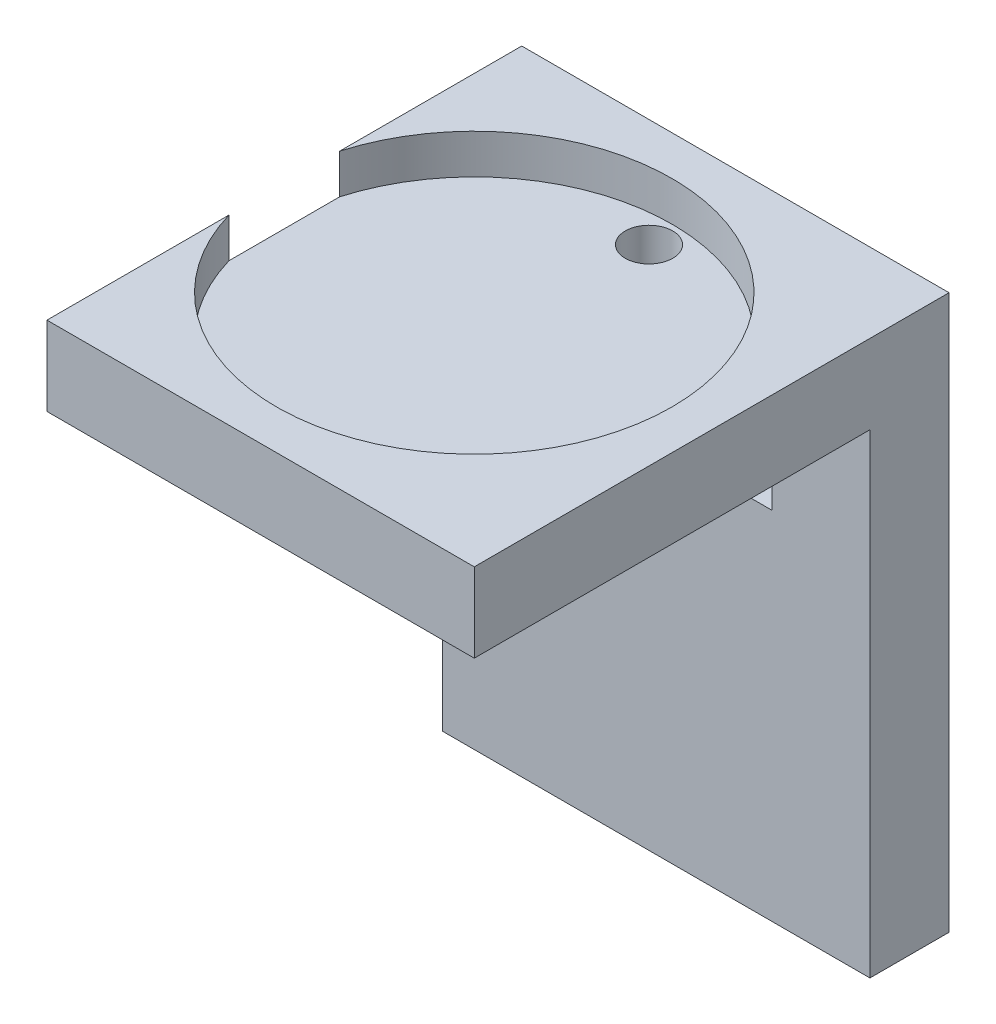
ISO-10303-21;
HEADER;
FILE_DESCRIPTION(('STEP AP214'),'2;1');
FILE_NAME('part.step','',(''),(''),'','','');
FILE_SCHEMA(('AUTOMOTIVE_DESIGN { 1 0 10303 214 1 1 1 1 }'));
ENDSEC;
DATA;
#1=APPLICATION_CONTEXT('core data for automotive mechanical design processes');
#2=APPLICATION_PROTOCOL_DEFINITION('international standard','automotive_design',2000,#1);
#3=PRODUCT_CONTEXT('',#1,'mechanical');
#4=PRODUCT('Part','Part','',(#3));
#5=PRODUCT_RELATED_PRODUCT_CATEGORY('part','',(#4));
#6=PRODUCT_DEFINITION_FORMATION('','',#4);
#7=PRODUCT_DEFINITION_CONTEXT('part definition',#1,'design');
#8=PRODUCT_DEFINITION('design','',#6,#7);
#9=PRODUCT_DEFINITION_SHAPE('','',#8);
#10=(LENGTH_UNIT() NAMED_UNIT(*) SI_UNIT(.MILLI.,.METRE.));
#11=(NAMED_UNIT(*) PLANE_ANGLE_UNIT() SI_UNIT($,.RADIAN.));
#12=(NAMED_UNIT(*) SI_UNIT($,.STERADIAN.) SOLID_ANGLE_UNIT());
#13=UNCERTAINTY_MEASURE_WITH_UNIT(LENGTH_MEASURE(1.E-05),#10,'distance_accuracy_value','');
#14=(GEOMETRIC_REPRESENTATION_CONTEXT(3) GLOBAL_UNCERTAINTY_ASSIGNED_CONTEXT((#13)) GLOBAL_UNIT_ASSIGNED_CONTEXT((#10,
#11,#12)) REPRESENTATION_CONTEXT('',''));
#15=CARTESIAN_POINT('',(0.,0.,0.));
#16=DIRECTION('',(0.,0.,1.));
#17=DIRECTION('',(1.,0.,0.));
#18=AXIS2_PLACEMENT_3D('',#15,#16,#17);
#19=CARTESIAN_POINT('',(0.,530.,0.));
#20=DIRECTION('',(0.,0.,-1.));
#21=DIRECTION('',(-1.,0.,0.));
#22=AXIS2_PLACEMENT_3D('',#19,#20,#21);
#23=PLANE('',#22);
#24=DIRECTION('',(-1.,0.,0.));
#25=VECTOR('',#24,1.);
#26=CARTESIAN_POINT('',(0.,280.,0.));
#27=LINE('',#26,#25);
#28=CARTESIAN_POINT('',(230.,280.,0.));
#29=VERTEX_POINT('',#28);
#30=CARTESIAN_POINT('',(122.,280.,0.));
#31=VERTEX_POINT('',#30);
#32=EDGE_CURVE('E182',#29,#31,#27,.T.);
#33=ORIENTED_EDGE('',*,*,#32,.T.);
#34=DIRECTION('',(0.,-1.,0.));
#35=VECTOR('',#34,1.);
#36=CARTESIAN_POINT('',(122.,530.,0.));
#37=LINE('',#36,#35);
#38=CARTESIAN_POINT('',(122.,260.,0.));
#39=VERTEX_POINT('',#38);
#40=EDGE_CURVE('E482',#31,#39,#37,.T.);
#41=ORIENTED_EDGE('',*,*,#40,.T.);
#42=DIRECTION('',(-1.,0.,0.));
#43=VECTOR('',#42,1.);
#44=CARTESIAN_POINT('',(9.99999999999982,260.,0.));
#45=LINE('',#44,#43);
#46=CARTESIAN_POINT('',(230.,260.,0.));
#47=VERTEX_POINT('',#46);
#48=EDGE_CURVE('E246',#47,#39,#45,.T.);
#49=ORIENTED_EDGE('',*,*,#48,.F.);
#50=DIRECTION('',(0.,-1.,0.));
#51=VECTOR('',#50,1.);
#52=CARTESIAN_POINT('',(230.,0.,0.));
#53=LINE('',#52,#51);
#54=EDGE_CURVE('E165',#29,#47,#53,.T.);
#55=ORIENTED_EDGE('',*,*,#54,.F.);
#56=EDGE_LOOP('',(#33,#41,#49,#55));
#57=FACE_BOUND('',#56,.T.);
#58=ADVANCED_FACE('F38',(#57),#23,.F.);
#59=CARTESIAN_POINT('',(0.,530.,-120.));
#60=DIRECTION('',(0.,0.,1.));
#61=DIRECTION('',(1.,0.,0.));
#62=AXIS2_PLACEMENT_3D('',#59,#60,#61);
#63=PLANE('',#62);
#64=DIRECTION('',(0.,1.,0.));
#65=VECTOR('',#64,1.);
#66=CARTESIAN_POINT('',(205.198613037107,530.,-120.));
#67=LINE('',#66,#65);
#68=CARTESIAN_POINT('',(205.198613037107,230.,-120.));
#69=VERTEX_POINT('',#68);
#70=CARTESIAN_POINT('',(205.198613037107,260.,-120.));
#71=VERTEX_POINT('',#70);
#72=EDGE_CURVE('E219',#69,#71,#67,.T.);
#73=ORIENTED_EDGE('',*,*,#72,.T.);
#74=DIRECTION('',(-1.,0.,0.));
#75=VECTOR('',#74,1.);
#76=CARTESIAN_POINT('',(0.,260.,-120.));
#77=LINE('',#76,#75);
#78=CARTESIAN_POINT('',(185.198613037107,260.,-120.));
#79=VERTEX_POINT('',#78);
#80=EDGE_CURVE('E223',#71,#79,#77,.T.);
#81=ORIENTED_EDGE('',*,*,#80,.T.);
#82=DIRECTION('',(0.,-1.,0.));
#83=VECTOR('',#82,1.);
#84=CARTESIAN_POINT('',(185.198613037106,530.000000000001,-120.));
#85=LINE('',#84,#83);
#86=CARTESIAN_POINT('',(185.198613037107,230.,-120.));
#87=VERTEX_POINT('',#86);
#88=EDGE_CURVE('E203',#79,#87,#85,.T.);
#89=ORIENTED_EDGE('',*,*,#88,.T.);
#90=DIRECTION('',(1.,0.,0.));
#91=VECTOR('',#90,1.);
#92=CARTESIAN_POINT('',(0.,230.,-120.));
#93=LINE('',#92,#91);
#94=EDGE_CURVE('E215',#87,#69,#93,.T.);
#95=ORIENTED_EDGE('',*,*,#94,.T.);
#96=EDGE_LOOP('',(#73,#81,#89,#95));
#97=FACE_BOUND('',#96,.T.);
#98=DIRECTION('',(0.,-1.,0.));
#99=VECTOR('',#98,1.);
#100=CARTESIAN_POINT('',(230.,0.,-120.));
#101=LINE('',#100,#99);
#102=CARTESIAN_POINT('',(230.,280.,-120.));
#103=VERTEX_POINT('',#102);
#104=CARTESIAN_POINT('',(230.,140.,-120.));
#105=VERTEX_POINT('',#104);
#106=EDGE_CURVE('E154',#103,#105,#101,.T.);
#107=ORIENTED_EDGE('',*,*,#106,.T.);
#108=DIRECTION('',(-1.,0.,0.));
#109=VECTOR('',#108,1.);
#110=CARTESIAN_POINT('',(122.,140.,-120.));
#111=LINE('',#110,#109);
#112=CARTESIAN_POINT('',(122.,140.,-120.));
#113=VERTEX_POINT('',#112);
#114=EDGE_CURVE('E139',#105,#113,#111,.T.);
#115=ORIENTED_EDGE('',*,*,#114,.T.);
#116=DIRECTION('',(0.,-1.,0.));
#117=VECTOR('',#116,1.);
#118=CARTESIAN_POINT('',(122.,0.,-120.));
#119=LINE('',#118,#117);
#120=CARTESIAN_POINT('',(122.,280.,-120.));
#121=VERTEX_POINT('',#120);
#122=EDGE_CURVE('E493',#121,#113,#119,.T.);
#123=ORIENTED_EDGE('',*,*,#122,.F.);
#124=DIRECTION('',(1.,0.,0.));
#125=VECTOR('',#124,1.);
#126=CARTESIAN_POINT('',(0.,280.,-120.));
#127=LINE('',#126,#125);
#128=EDGE_CURVE('E162',#121,#103,#127,.T.);
#129=ORIENTED_EDGE('',*,*,#128,.T.);
#130=EDGE_LOOP('',(#107,#115,#123,#129));
#131=FACE_BOUND('',#130,.T.);
#132=ADVANCED_FACE('F160',(#97,#131),#63,.F.);
#133=CARTESIAN_POINT('',(9.99999999999982,260.,-100.));
#134=DIRECTION('',(0.,1.,0.));
#135=DIRECTION('',(0.,0.,1.));
#136=AXIS2_PLACEMENT_3D('',#133,#134,#135);
#137=PLANE('',#136);
#138=ORIENTED_EDGE('',*,*,#48,.T.);
#139=DIRECTION('',(0.,0.,-1.));
#140=VECTOR('',#139,1.);
#141=CARTESIAN_POINT('',(122.,260.,-100.));
#142=LINE('',#141,#140);
#143=CARTESIAN_POINT('',(122.,260.,-100.));
#144=VERTEX_POINT('',#143);
#145=EDGE_CURVE('E316',#39,#144,#142,.T.);
#146=ORIENTED_EDGE('',*,*,#145,.T.);
#147=DIRECTION('',(-1.,0.,0.));
#148=VECTOR('',#147,1.);
#149=CARTESIAN_POINT('',(9.99999999999982,260.,-100.));
#150=LINE('',#149,#148);
#151=CARTESIAN_POINT('',(166.152945409262,260.,-100.));
#152=VERTEX_POINT('',#151);
#153=EDGE_CURVE('E252',#152,#144,#150,.T.);
#154=ORIENTED_EDGE('',*,*,#153,.F.);
#155=CARTESIAN_POINT('',(171.556693712767,260.,-102.607585908913));
#156=DIRECTION('',(0.,1.,0.));
#157=DIRECTION('',(0.,0.,1.));
#158=AXIS2_PLACEMENT_3D('',#155,#156,#157);
#159=CIRCLE('',#158,5.99999999999999);
#160=CARTESIAN_POINT('',(176.960442016273,260.,-100.));
#161=VERTEX_POINT('',#160);
#162=EDGE_CURVE('E234',#152,#161,#159,.T.);
#163=ORIENTED_EDGE('',*,*,#162,.T.);
#164=CARTESIAN_POINT('',(185.198613037107,260.,-100.));
#165=VERTEX_POINT('',#164);
#166=EDGE_CURVE('E251',#165,#161,#150,.T.);
#167=ORIENTED_EDGE('',*,*,#166,.F.);
#168=DIRECTION('',(0.,0.,1.));
#169=VECTOR('',#168,1.);
#170=CARTESIAN_POINT('',(185.198613037107,260.,-180.));
#171=LINE('',#170,#169);
#172=EDGE_CURVE('E198',#79,#165,#171,.T.);
#173=ORIENTED_EDGE('',*,*,#172,.F.);
#174=ORIENTED_EDGE('',*,*,#80,.F.);
#175=DIRECTION('',(0.,0.,1.));
#176=VECTOR('',#175,1.);
#177=CARTESIAN_POINT('',(205.198613037107,260.,-180.));
#178=LINE('',#177,#176);
#179=CARTESIAN_POINT('',(205.198613037107,260.,-100.));
#180=VERTEX_POINT('',#179);
#181=EDGE_CURVE('E199',#71,#180,#178,.T.);
#182=ORIENTED_EDGE('',*,*,#181,.T.);
#183=CARTESIAN_POINT('',(230.,260.,-100.));
#184=VERTEX_POINT('',#183);
#185=EDGE_CURVE('E247',#184,#180,#150,.T.);
#186=ORIENTED_EDGE('',*,*,#185,.F.);
#187=DIRECTION('',(0.,0.,1.));
#188=VECTOR('',#187,1.);
#189=CARTESIAN_POINT('',(230.,260.,-100.));
#190=LINE('',#189,#188);
#191=EDGE_CURVE('E176',#184,#47,#190,.T.);
#192=ORIENTED_EDGE('',*,*,#191,.T.);
#193=EDGE_LOOP('',(#138,#146,#154,#163,#167,#173,#174,#182,#186,#192));
#194=FACE_BOUND('',#193,.T.);
#195=ADVANCED_FACE('F276',(#194),#137,.F.);
#196=CARTESIAN_POINT('',(0.,0.,-100.));
#197=DIRECTION('',(0.,0.,-1.));
#198=DIRECTION('',(-1.,0.,0.));
#199=AXIS2_PLACEMENT_3D('',#196,#197,#198);
#200=PLANE('',#199);
#201=DIRECTION('',(0.,-1.,0.));
#202=VECTOR('',#201,1.);
#203=CARTESIAN_POINT('',(122.,0.,-100.));
#204=LINE('',#203,#202);
#205=CARTESIAN_POINT('',(122.,140.,-100.));
#206=VERTEX_POINT('',#205);
#207=EDGE_CURVE('E170',#144,#206,#204,.T.);
#208=ORIENTED_EDGE('',*,*,#207,.T.);
#209=DIRECTION('',(1.,0.,0.));
#210=VECTOR('',#209,1.);
#211=CARTESIAN_POINT('',(0.,140.,-100.));
#212=LINE('',#211,#210);
#213=CARTESIAN_POINT('',(230.,140.,-100.));
#214=VERTEX_POINT('',#213);
#215=EDGE_CURVE('E53',#206,#214,#212,.T.);
#216=ORIENTED_EDGE('',*,*,#215,.T.);
#217=DIRECTION('',(0.,1.,0.));
#218=VECTOR('',#217,1.);
#219=CARTESIAN_POINT('',(230.,0.,-100.));
#220=LINE('',#219,#218);
#221=EDGE_CURVE('E157',#214,#184,#220,.T.);
#222=ORIENTED_EDGE('',*,*,#221,.T.);
#223=ORIENTED_EDGE('',*,*,#185,.T.);
#224=DIRECTION('',(0.,1.,0.));
#225=VECTOR('',#224,1.);
#226=CARTESIAN_POINT('',(205.198613037107,260.,-100.));
#227=LINE('',#226,#225);
#228=CARTESIAN_POINT('',(205.198613037107,230.,-100.));
#229=VERTEX_POINT('',#228);
#230=EDGE_CURVE('E194',#229,#180,#227,.T.);
#231=ORIENTED_EDGE('',*,*,#230,.F.);
#232=DIRECTION('',(1.,0.,0.));
#233=VECTOR('',#232,1.);
#234=CARTESIAN_POINT('',(185.198613037107,230.,-100.));
#235=LINE('',#234,#233);
#236=CARTESIAN_POINT('',(185.198613037107,230.,-100.));
#237=VERTEX_POINT('',#236);
#238=EDGE_CURVE('E190',#237,#229,#235,.T.);
#239=ORIENTED_EDGE('',*,*,#238,.F.);
#240=DIRECTION('',(0.,-1.,0.));
#241=VECTOR('',#240,1.);
#242=CARTESIAN_POINT('',(185.198613037107,260.,-100.));
#243=LINE('',#242,#241);
#244=EDGE_CURVE('E186',#165,#237,#243,.T.);
#245=ORIENTED_EDGE('',*,*,#244,.F.);
#246=ORIENTED_EDGE('',*,*,#166,.T.);
#247=DIRECTION('',(0.,1.,0.));
#248=VECTOR('',#247,1.);
#249=CARTESIAN_POINT('',(176.960442016273,270.,-100.));
#250=LINE('',#249,#248);
#251=CARTESIAN_POINT('',(176.960442016273,240.,-100.));
#252=VERTEX_POINT('',#251);
#253=EDGE_CURVE('E265',#161,#252,#250,.F.);
#254=ORIENTED_EDGE('',*,*,#253,.T.);
#255=CARTESIAN_POINT('',(140.66870930764,255.020227310839,-100.));
#256=CARTESIAN_POINT('',(141.745545016972,254.375511154288,-100.));
#257=CARTESIAN_POINT('',(142.82247043188,253.730944662981,-100.));
#258=CARTESIAN_POINT('',(144.976662301267,252.442279965616,-100.));
#259=CARTESIAN_POINT('',(146.053928768085,251.798181780186,-100.));
#260=CARTESIAN_POINT('',(148.209987572857,250.510011477218,-100.));
#261=CARTESIAN_POINT('',(149.28878033758,249.865940073759,-100.));
#262=CARTESIAN_POINT('',(151.446955898395,248.578886119505,-100.));
#263=CARTESIAN_POINT('',(152.526338668762,247.93590352558,-100.));
#264=CARTESIAN_POINT('',(154.686388472894,246.65147706289,-100.));
#265=CARTESIAN_POINT('',(155.767055761645,246.010033622458,-100.));
#266=CARTESIAN_POINT('',(157.389500303464,245.050153351026,-100.));
#267=CARTESIAN_POINT('',(157.930589671992,244.730554138623,-100.));
#268=CARTESIAN_POINT('',(159.013416216859,244.092468454552,-100.));
#269=CARTESIAN_POINT('',(159.555153385662,243.773981970105,-100.));
#270=CARTESIAN_POINT('',(160.639223238488,243.138843378282,-100.));
#271=CARTESIAN_POINT('',(161.181555295487,242.822190201106,-100.));
#272=CARTESIAN_POINT('',(162.267694660169,242.191361025225,-100.));
#273=CARTESIAN_POINT('',(162.811502032711,241.87718513788,-100.));
#274=CARTESIAN_POINT('',(163.628964829865,241.40911473811,-100.));
#275=CARTESIAN_POINT('',(163.90171493313,241.253640073062,-100.));
#276=CARTESIAN_POINT('',(164.448025651478,240.944122360932,-100.));
#277=CARTESIAN_POINT('',(164.721586262407,240.790079306528,-100.));
#278=CARTESIAN_POINT('',(165.269789155945,240.483975338393,-100.));
#279=CARTESIAN_POINT('',(165.544431358033,240.331914280613,-100.));
#280=CARTESIAN_POINT('',(166.095251179756,240.030602810183,-100.));
#281=CARTESIAN_POINT('',(166.371428757506,239.881352321343,-100.));
#282=CARTESIAN_POINT('',(166.762126208396,239.67404897672,-100.));
#283=CARTESIAN_POINT('',(166.87571122211,239.614234359213,-100.));
#284=CARTESIAN_POINT('',(167.103329940756,239.495460860026,-100.));
#285=CARTESIAN_POINT('',(167.217363650562,239.436501987676,-100.));
#286=CARTESIAN_POINT('',(167.445980754043,239.319605922707,-100.));
#287=CARTESIAN_POINT('',(167.560564245109,239.261668920302,-100.));
#288=CARTESIAN_POINT('',(167.790361265167,239.147057098279,-100.));
#289=CARTESIAN_POINT('',(167.905574791467,239.090382273276,-100.));
#290=CARTESIAN_POINT('',(168.137542344556,238.978210376383,-100.));
#291=CARTESIAN_POINT('',(168.254301519405,238.922723923874,-100.));
#292=CARTESIAN_POINT('',(168.488737749721,238.813726975447,-100.));
#293=CARTESIAN_POINT('',(168.606414781917,238.76021642963,-100.));
#294=CARTESIAN_POINT('',(168.842857037724,238.655701412191,-100.));
#295=CARTESIAN_POINT('',(168.961622064727,238.604696497981,-100.));
#296=CARTESIAN_POINT('',(169.200469619515,238.505884504628,-100.));
#297=CARTESIAN_POINT('',(169.320552042238,238.458077172607,-100.));
#298=CARTESIAN_POINT('',(169.588267597971,238.356733281234,-100.));
#299=CARTESIAN_POINT('',(169.73627554076,238.304173466758,-100.));
#300=CARTESIAN_POINT('',(170.035030725225,238.207321331566,-100.));
#301=CARTESIAN_POINT('',(170.185778103406,238.163029424085,-100.));
#302=CARTESIAN_POINT('',(170.488188779936,238.086097099034,-100.));
#303=CARTESIAN_POINT('',(170.639814475566,238.053312221658,-100.));
#304=CARTESIAN_POINT('',(170.945466248453,238.001700721255,-100.));
#305=CARTESIAN_POINT('',(171.099491167642,237.982867564836,-100.));
#306=CARTESIAN_POINT('',(171.332561554369,237.966705001602,-100.));
#307=CARTESIAN_POINT('',(171.411217067294,237.963354736134,-100.));
#308=CARTESIAN_POINT('',(171.568599505715,237.96093680994,-100.));
#309=CARTESIAN_POINT('',(171.647326430792,237.961869124181,-100.));
#310=CARTESIAN_POINT('',(171.804612760325,237.96799062918,-100.));
#311=CARTESIAN_POINT('',(171.883172164762,237.973179820443,-100.));
#312=CARTESIAN_POINT('',(172.0399203249,237.98762763523,-100.));
#313=CARTESIAN_POINT('',(172.11810901431,237.996886960745,-100.));
#314=CARTESIAN_POINT('',(172.353817741922,238.030620125301,-100.));
#315=CARTESIAN_POINT('',(172.510522986131,238.060961578936,-100.));
#316=CARTESIAN_POINT('',(172.743315393228,238.115695470083,-100.));
#317=CARTESIAN_POINT('',(172.820556473922,238.13548384642,-100.));
#318=CARTESIAN_POINT('',(172.974307563305,238.177729555461,-100.));
#319=CARTESIAN_POINT('',(173.050817602283,238.200186777068,-100.));
#320=CARTESIAN_POINT('',(173.250665862279,238.262130404965,-100.));
#321=CARTESIAN_POINT('',(173.373419728525,238.303495561997,-100.));
#322=CARTESIAN_POINT('',(173.6172588527,238.390911421347,-100.));
#323=CARTESIAN_POINT('',(173.738343705826,238.436963238431,-100.));
#324=CARTESIAN_POINT('',(173.979172666962,238.53273132483,-100.));
#325=CARTESIAN_POINT('',(174.098915473261,238.582450847863,-100.));
#326=CARTESIAN_POINT('',(174.337173237009,238.684708547525,-100.));
#327=CARTESIAN_POINT('',(174.455688293528,238.737246494579,-100.));
#328=CARTESIAN_POINT('',(174.692030619059,238.844686876755,-100.));
#329=CARTESIAN_POINT('',(174.809855108878,238.899595403734,-100.));
#330=CARTESIAN_POINT('',(175.044661762844,239.011188053382,-100.));
#331=CARTESIAN_POINT('',(175.161643902324,239.06787222779,-100.));
#332=CARTESIAN_POINT('',(175.5114263292,239.239986042704,-100.));
#333=CARTESIAN_POINT('',(175.743183798586,239.357532994722,-100.));
#334=CARTESIAN_POINT('',(176.206674113443,239.597368577542,-100.));
#335=CARTESIAN_POINT('',(176.438390580959,239.719688615419,-100.));
#336=CARTESIAN_POINT('',(176.900423461,239.966999327591,-100.));
#337=CARTESIAN_POINT('',(177.130739718648,240.091990290652,-100.));
#338=CARTESIAN_POINT('',(177.589882417134,240.343640495827,-100.));
#339=CARTESIAN_POINT('',(177.818710867789,240.470296079725,-100.));
#340=CARTESIAN_POINT('',(178.275568382777,240.725018610191,-100.));
#341=CARTESIAN_POINT('',(178.503597477372,240.85308550255,-100.));
#342=CARTESIAN_POINT('',(179.180935094493,241.235579017768,-100.));
#343=CARTESIAN_POINT('',(179.629372766938,241.491546662386,-100.));
#344=CARTESIAN_POINT('',(180.524786827119,242.006027467012,-100.));
#345=CARTESIAN_POINT('',(180.971763200384,242.264540652127,-100.));
#346=CARTESIAN_POINT('',(181.864747552623,242.783271882302,-100.));
#347=CARTESIAN_POINT('',(182.310755494456,243.043489991261,-100.));
#348=CARTESIAN_POINT('',(183.202081163217,243.565106104294,-100.));
#349=CARTESIAN_POINT('',(183.647398889107,243.826504110136,-100.));
#350=CARTESIAN_POINT('',(184.983434411144,244.612437757886,-100.));
#351=CARTESIAN_POINT('',(185.873411101031,245.138232793207,-100.));
#352=CARTESIAN_POINT('',(187.652229968038,246.191696812352,-100.));
#353=CARTESIAN_POINT('',(188.541072166644,246.71936575995,-100.));
#354=CARTESIAN_POINT('',(190.272563735469,247.748852611933,-100.));
#355=CARTESIAN_POINT('',(191.115248468207,248.250611048623,-100.));
#356=CARTESIAN_POINT('',(192.800189868967,249.254857987687,-100.));
#357=CARTESIAN_POINT('',(193.642446534254,249.757346494648,-100.));
#358=CARTESIAN_POINT('',(195.325819468977,250.762339234044,-100.));
#359=CARTESIAN_POINT('',(196.166936041845,251.264842958297,-100.));
#360=CARTESIAN_POINT('',(197.848933320306,252.270232124848,-100.));
#361=CARTESIAN_POINT('',(198.689814027453,252.773117564544,-100.));
#362=CARTESIAN_POINT('',(199.53061755367,253.276131874134,-100.));
#363=B_SPLINE_CURVE_WITH_KNOTS('',3,(#255,#256,#257,#258,#259,#260,#261,#262,#263,#264,#265,
#266,#267,#268,#269,#270,#271,#272,#273,#274,#275,#276,#277,#278,#279,#280,#281,#282,#283,#284,
#285,#286,#287,#288,#289,#290,#291,#292,#293,#294,#295,#296,#297,#298,#299,#300,#301,#302,#303,
#304,#305,#306,#307,#308,#309,#310,#311,#312,#313,#314,#315,#316,#317,#318,#319,#320,#321,#322,
#323,#324,#325,#326,#327,#328,#329,#330,#331,#332,#333,#334,#335,#336,#337,#338,#339,#340,#341,
#342,#343,#344,#345,#346,#347,#348,#349,#350,#351,#352,#353,#354,#355,#356,#357,#358,#359,#360,
#361,#362),.UNSPECIFIED.,.F.,.F.,(4,2,2,2,2,2,2,2,2,2,2,2,2,2,2,2,2,2,2,2,2,2,2,2,2,2,2,2,2,2,2,
2,2,2,2,2,2,2,2,2,2,2,2,2,2,2,2,2,2,2,2,2,2,4),(0.,3.76524998170982,7.53065681727313,
11.2999528721338,15.0690959484566,18.8391883257358,20.724470583309,22.6097311181685,
24.4937502552806,26.3778536052763,27.3197025469165,28.261546668986,29.2033219522121,
30.1450716684229,30.5301845448842,30.9153016165462,31.3004896341273,31.6856760081172,
32.0734796754741,32.4612735427971,32.8489986631907,33.2366930844613,33.707706101691,
34.1787426541159,34.6436343837702,35.1083082733584,35.3443871450296,35.5804646367498,
35.81654215651,36.0526604095171,36.5307486293776,36.769925950269,37.0090933183722,
37.3975697492823,37.7861387999268,38.1750568047807,38.5639431781515,38.9538965223592,
39.3438612395432,40.1233903096002,40.909431175455,41.6955574578999,42.4801764441517,
43.2647653966137,44.8137947948122,46.3628394871519,47.91194257289,49.4610479830774,
52.5621185511612,55.663129492585,58.6053919358587,61.5476729496611,64.4870407471998,
67.426388680556),.UNSPECIFIED.);
#364=CARTESIAN_POINT('',(166.152945409262,240.,-100.));
#365=VERTEX_POINT('',#364);
#366=EDGE_CURVE('E250',#252,#365,#363,.F.);
#367=ORIENTED_EDGE('',*,*,#366,.T.);
#368=DIRECTION('',(0.,1.,0.));
#369=VECTOR('',#368,1.);
#370=CARTESIAN_POINT('',(166.152945409262,270.,-100.));
#371=LINE('',#370,#369);
#372=EDGE_CURVE('E46',#365,#152,#371,.T.);
#373=ORIENTED_EDGE('',*,*,#372,.T.);
#374=ORIENTED_EDGE('',*,*,#153,.T.);
#375=EDGE_LOOP('',(#208,#216,#222,#223,#231,#239,#245,#246,#254,#367,#373,#374));
#376=FACE_BOUND('',#375,.T.);
#377=ADVANCED_FACE('F270',(#376),#200,.F.);
#378=CARTESIAN_POINT('',(340.,280.,-100.));
#379=DIRECTION('',(0.,-1.,0.));
#380=DIRECTION('',(0.,0.,-1.));
#381=AXIS2_PLACEMENT_3D('',#378,#379,#380);
#382=PLANE('',#381);
#383=ORIENTED_EDGE('',*,*,#128,.F.);
#384=DIRECTION('',(0.,0.,1.));
#385=VECTOR('',#384,1.);
#386=CARTESIAN_POINT('',(122.,280.,-100.));
#387=LINE('',#386,#385);
#388=CARTESIAN_POINT('',(122.,280.,-73.9999999999998));
#389=VERTEX_POINT('',#388);
#390=EDGE_CURVE('E480',#121,#389,#387,.T.);
#391=ORIENTED_EDGE('',*,*,#390,.T.);
#392=CARTESIAN_POINT('',(170.,280.,-60.));
#393=DIRECTION('',(0.,-1.,0.));
#394=DIRECTION('',(0.,0.,-1.));
#395=AXIS2_PLACEMENT_3D('',#392,#393,#394);
#396=CIRCLE('',#395,50.);
#397=CARTESIAN_POINT('',(122.,280.,-46.0000000000001));
#398=VERTEX_POINT('',#397);
#399=EDGE_CURVE('E242',#389,#398,#396,.T.);
#400=ORIENTED_EDGE('',*,*,#399,.T.);
#401=EDGE_CURVE('E479',#398,#31,#387,.T.);
#402=ORIENTED_EDGE('',*,*,#401,.T.);
#403=ORIENTED_EDGE('',*,*,#32,.F.);
#404=DIRECTION('',(0.,0.,1.));
#405=VECTOR('',#404,1.);
#406=CARTESIAN_POINT('',(230.,280.,-120.));
#407=LINE('',#406,#405);
#408=EDGE_CURVE('E164',#103,#29,#407,.T.);
#409=ORIENTED_EDGE('',*,*,#408,.F.);
#410=EDGE_LOOP('',(#383,#391,#400,#402,#403,#409));
#411=FACE_BOUND('',#410,.T.);
#412=ADVANCED_FACE('F275',(#411),#382,.F.);
#413=CARTESIAN_POINT('',(170.,270.,-60.));
#414=DIRECTION('',(0.,1.,0.));
#415=DIRECTION('',(0.,0.,1.));
#416=AXIS2_PLACEMENT_3D('',#413,#414,#415);
#417=CYLINDRICAL_SURFACE('',#416,50.);
#418=ORIENTED_EDGE('',*,*,#399,.F.);
#419=DIRECTION('',(0.,1.,0.));
#420=VECTOR('',#419,1.);
#421=CARTESIAN_POINT('',(122.,270.,-73.9999999999998));
#422=LINE('',#421,#420);
#423=CARTESIAN_POINT('',(122.,270.,-73.9999999999998));
#424=VERTEX_POINT('',#423);
#425=EDGE_CURVE('E475',#389,#424,#422,.F.);
#426=ORIENTED_EDGE('',*,*,#425,.T.);
#427=CARTESIAN_POINT('',(170.,270.,-60.));
#428=DIRECTION('',(0.,1.,0.));
#429=DIRECTION('',(0.,0.,1.));
#430=AXIS2_PLACEMENT_3D('',#427,#428,#429);
#431=CIRCLE('',#430,50.);
#432=CARTESIAN_POINT('',(122.,270.,-46.0000000000001));
#433=VERTEX_POINT('',#432);
#434=EDGE_CURVE('E238',#433,#424,#431,.T.);
#435=ORIENTED_EDGE('',*,*,#434,.F.);
#436=DIRECTION('',(0.,1.,0.));
#437=VECTOR('',#436,1.);
#438=CARTESIAN_POINT('',(122.,270.,-46.0000000000001));
#439=LINE('',#438,#437);
#440=EDGE_CURVE('E60',#433,#398,#439,.T.);
#441=ORIENTED_EDGE('',*,*,#440,.T.);
#442=EDGE_LOOP('',(#418,#426,#435,#441));
#443=FACE_BOUND('',#442,.T.);
#444=ADVANCED_FACE('F332',(#443),#417,.F.);
#445=CARTESIAN_POINT('',(170.,270.,-60.));
#446=DIRECTION('',(0.,1.,0.));
#447=DIRECTION('',(0.,0.,1.));
#448=AXIS2_PLACEMENT_3D('',#445,#446,#447);
#449=PLANE('',#448);
#450=DIRECTION('',(0.,0.,-1.));
#451=VECTOR('',#450,1.);
#452=CARTESIAN_POINT('',(122.,270.,-60.));
#453=LINE('',#452,#451);
#454=EDGE_CURVE('E11',#433,#424,#453,.T.);
#455=ORIENTED_EDGE('',*,*,#454,.F.);
#456=ORIENTED_EDGE('',*,*,#434,.T.);
#457=EDGE_LOOP('',(#455,#456));
#458=FACE_BOUND('',#457,.T.);
#459=CARTESIAN_POINT('',(171.556693712767,270.,-102.607585908913));
#460=DIRECTION('',(0.,1.,0.));
#461=DIRECTION('',(0.,0.,1.));
#462=AXIS2_PLACEMENT_3D('',#459,#460,#461);
#463=CIRCLE('',#462,5.99999999999998);
#464=CARTESIAN_POINT('',(171.556693712767,270.,-96.6075859089127));
#465=VERTEX_POINT('',#464);
#466=EDGE_CURVE('E227',#465,#465,#463,.T.);
#467=ORIENTED_EDGE('',*,*,#466,.F.);
#468=EDGE_LOOP('',(#467));
#469=FACE_BOUND('',#468,.T.);
#470=ADVANCED_FACE('F327',(#458,#469),#449,.T.);
#471=CARTESIAN_POINT('',(171.556693712767,270.,-102.607585908913));
#472=DIRECTION('',(0.,1.,0.));
#473=DIRECTION('',(0.,0.,1.));
#474=AXIS2_PLACEMENT_3D('',#471,#472,#473);
#475=CYLINDRICAL_SURFACE('',#474,5.99999999999999);
#476=ORIENTED_EDGE('',*,*,#466,.T.);
#477=EDGE_LOOP('',(#476));
#478=FACE_BOUND('',#477,.T.);
#479=CARTESIAN_POINT('',(171.556693712767,240.,-102.607585908913));
#480=DIRECTION('',(0.,1.,0.));
#481=DIRECTION('',(0.,0.,1.));
#482=AXIS2_PLACEMENT_3D('',#479,#480,#481);
#483=CIRCLE('',#482,6.00000000000001);
#484=EDGE_CURVE('E231',#252,#365,#483,.T.);
#485=ORIENTED_EDGE('',*,*,#484,.F.);
#486=ORIENTED_EDGE('',*,*,#253,.F.);
#487=ORIENTED_EDGE('',*,*,#162,.F.);
#488=ORIENTED_EDGE('',*,*,#372,.F.);
#489=EDGE_LOOP('',(#485,#486,#487,#488));
#490=FACE_BOUND('',#489,.T.);
#491=ADVANCED_FACE('F309',(#478,#490),#475,.F.);
#492=CARTESIAN_POINT('',(171.556693712767,240.,-102.607585908913));
#493=DIRECTION('',(0.,1.,0.));
#494=DIRECTION('',(0.,0.,1.));
#495=AXIS2_PLACEMENT_3D('',#492,#493,#494);
#496=CONICAL_SURFACE('',#495,6.00000000000001,1.02974425867666);
#497=CARTESIAN_POINT('',(171.556693712767,236.394836285835,-102.607585908913));
#498=VERTEX_POINT('',#497);
#499=VERTEX_LOOP('',#498);
#500=FACE_BOUND('',#499,.T.);
#501=ORIENTED_EDGE('',*,*,#484,.T.);
#502=ORIENTED_EDGE('',*,*,#366,.F.);
#503=EDGE_LOOP('',(#501,#502));
#504=FACE_BOUND('',#503,.T.);
#505=ADVANCED_FACE('F266',(#500,#504),#496,.F.);
#506=CARTESIAN_POINT('',(205.198613037107,260.,-180.));
#507=DIRECTION('',(1.,0.,0.));
#508=DIRECTION('',(0.,0.,-1.));
#509=AXIS2_PLACEMENT_3D('',#506,#507,#508);
#510=PLANE('',#509);
#511=DIRECTION('',(0.,0.,1.));
#512=VECTOR('',#511,1.);
#513=CARTESIAN_POINT('',(205.198613037107,230.,-180.));
#514=LINE('',#513,#512);
#515=EDGE_CURVE('E204',#69,#229,#514,.T.);
#516=ORIENTED_EDGE('',*,*,#515,.T.);
#517=ORIENTED_EDGE('',*,*,#230,.T.);
#518=ORIENTED_EDGE('',*,*,#181,.F.);
#519=ORIENTED_EDGE('',*,*,#72,.F.);
#520=EDGE_LOOP('',(#516,#517,#518,#519));
#521=FACE_BOUND('',#520,.T.);
#522=ADVANCED_FACE('F292',(#521),#510,.F.);
#523=CARTESIAN_POINT('',(185.198613037107,230.,-180.));
#524=DIRECTION('',(0.,-1.,0.));
#525=DIRECTION('',(0.,0.,-1.));
#526=AXIS2_PLACEMENT_3D('',#523,#524,#525);
#527=PLANE('',#526);
#528=DIRECTION('',(0.,0.,1.));
#529=VECTOR('',#528,1.);
#530=CARTESIAN_POINT('',(185.198613037107,230.,-180.));
#531=LINE('',#530,#529);
#532=EDGE_CURVE('E207',#87,#237,#531,.T.);
#533=ORIENTED_EDGE('',*,*,#532,.T.);
#534=ORIENTED_EDGE('',*,*,#238,.T.);
#535=ORIENTED_EDGE('',*,*,#515,.F.);
#536=ORIENTED_EDGE('',*,*,#94,.F.);
#537=EDGE_LOOP('',(#533,#534,#535,#536));
#538=FACE_BOUND('',#537,.T.);
#539=ADVANCED_FACE('F294',(#538),#527,.F.);
#540=CARTESIAN_POINT('',(185.198613037107,260.,-180.));
#541=DIRECTION('',(-1.,0.,0.));
#542=DIRECTION('',(0.,-1.,0.));
#543=AXIS2_PLACEMENT_3D('',#540,#541,#542);
#544=PLANE('',#543);
#545=ORIENTED_EDGE('',*,*,#172,.T.);
#546=ORIENTED_EDGE('',*,*,#244,.T.);
#547=ORIENTED_EDGE('',*,*,#532,.F.);
#548=ORIENTED_EDGE('',*,*,#88,.F.);
#549=EDGE_LOOP('',(#545,#546,#547,#548));
#550=FACE_BOUND('',#549,.T.);
#551=ADVANCED_FACE('F303',(#550),#544,.F.);
#552=CARTESIAN_POINT('',(230.,0.,-120.));
#553=DIRECTION('',(-1.,0.,0.));
#554=DIRECTION('',(0.,0.,1.));
#555=AXIS2_PLACEMENT_3D('',#552,#553,#554);
#556=PLANE('',#555);
#557=ORIENTED_EDGE('',*,*,#221,.F.);
#558=DIRECTION('',(0.,0.,1.));
#559=VECTOR('',#558,1.);
#560=CARTESIAN_POINT('',(230.,140.,-120.));
#561=LINE('',#560,#559);
#562=EDGE_CURVE('E142',#105,#214,#561,.T.);
#563=ORIENTED_EDGE('',*,*,#562,.F.);
#564=ORIENTED_EDGE('',*,*,#106,.F.);
#565=ORIENTED_EDGE('',*,*,#408,.T.);
#566=ORIENTED_EDGE('',*,*,#54,.T.);
#567=ORIENTED_EDGE('',*,*,#191,.F.);
#568=EDGE_LOOP('',(#557,#563,#564,#565,#566,#567));
#569=FACE_BOUND('',#568,.T.);
#570=ADVANCED_FACE('F153',(#569),#556,.F.);
#571=CARTESIAN_POINT('',(122.,0.,36.));
#572=DIRECTION('',(1.,0.,0.));
#573=DIRECTION('',(0.,0.,-1.));
#574=AXIS2_PLACEMENT_3D('',#571,#572,#573);
#575=PLANE('',#574);
#576=ORIENTED_EDGE('',*,*,#122,.T.);
#577=DIRECTION('',(0.,0.,1.));
#578=VECTOR('',#577,1.);
#579=CARTESIAN_POINT('',(122.,140.,-120.));
#580=LINE('',#579,#578);
#581=EDGE_CURVE('E143',#113,#206,#580,.T.);
#582=ORIENTED_EDGE('',*,*,#581,.T.);
#583=ORIENTED_EDGE('',*,*,#207,.F.);
#584=ORIENTED_EDGE('',*,*,#145,.F.);
#585=ORIENTED_EDGE('',*,*,#40,.F.);
#586=ORIENTED_EDGE('',*,*,#401,.F.);
#587=ORIENTED_EDGE('',*,*,#440,.F.);
#588=ORIENTED_EDGE('',*,*,#454,.T.);
#589=ORIENTED_EDGE('',*,*,#425,.F.);
#590=ORIENTED_EDGE('',*,*,#390,.F.);
#591=EDGE_LOOP('',(#576,#582,#583,#584,#585,#586,#587,#588,#589,#590));
#592=FACE_BOUND('',#591,.T.);
#593=ADVANCED_FACE('F341',(#592),#575,.F.);
#594=CARTESIAN_POINT('',(122.,140.,-120.));
#595=DIRECTION('',(0.,1.,0.));
#596=DIRECTION('',(0.,0.,1.));
#597=AXIS2_PLACEMENT_3D('',#594,#595,#596);
#598=PLANE('',#597);
#599=ORIENTED_EDGE('',*,*,#581,.F.);
#600=ORIENTED_EDGE('',*,*,#114,.F.);
#601=ORIENTED_EDGE('',*,*,#562,.T.);
#602=ORIENTED_EDGE('',*,*,#215,.F.);
#603=EDGE_LOOP('',(#599,#600,#601,#602));
#604=FACE_BOUND('',#603,.T.);
#605=ADVANCED_FACE('F141',(#604),#598,.F.);
#606=CLOSED_SHELL('',(#58,#132,#195,#377,#412,#444,#470,#491,#505,#522,#539,#551,#570,#593,#605));
#607=MANIFOLD_SOLID_BREP('B2',#606);
#608=ADVANCED_BREP_SHAPE_REPRESENTATION('',(#18,#607),#14);
#609=SHAPE_DEFINITION_REPRESENTATION(#9,#608);
ENDSEC;
END-ISO-10303-21;
